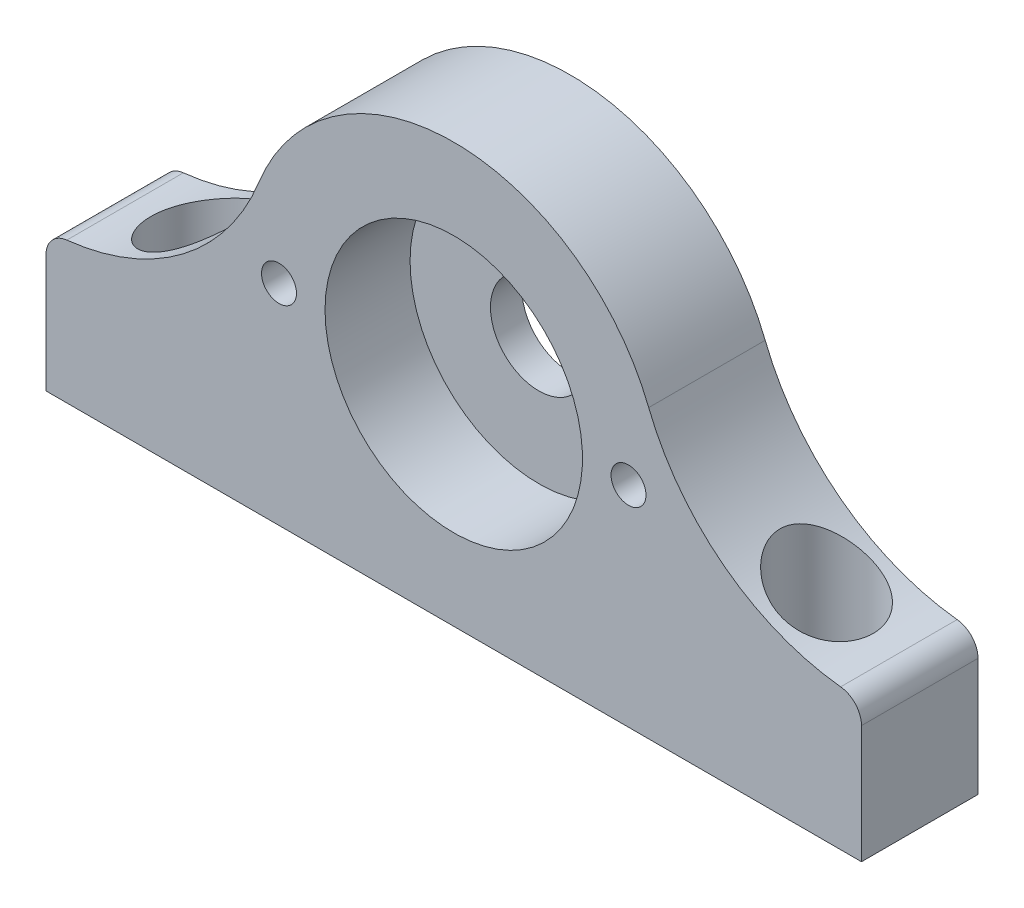
ISO-10303-21;
HEADER;
FILE_DESCRIPTION(('STEP AP214'),'2;1');
FILE_NAME('part.step','',(''),(''),'','','');
FILE_SCHEMA(('AUTOMOTIVE_DESIGN { 1 0 10303 214 1 1 1 1 }'));
ENDSEC;
DATA;
#1=APPLICATION_CONTEXT('core data for automotive mechanical design processes');
#2=APPLICATION_PROTOCOL_DEFINITION('international standard','automotive_design',2000,#1);
#3=PRODUCT_CONTEXT('',#1,'mechanical');
#4=PRODUCT('Part','Part','',(#3));
#5=PRODUCT_RELATED_PRODUCT_CATEGORY('part','',(#4));
#6=PRODUCT_DEFINITION_FORMATION('','',#4);
#7=PRODUCT_DEFINITION_CONTEXT('part definition',#1,'design');
#8=PRODUCT_DEFINITION('design','',#6,#7);
#9=PRODUCT_DEFINITION_SHAPE('','',#8);
#10=(LENGTH_UNIT() NAMED_UNIT(*) SI_UNIT(.MILLI.,.METRE.));
#11=(NAMED_UNIT(*) PLANE_ANGLE_UNIT() SI_UNIT($,.RADIAN.));
#12=(NAMED_UNIT(*) SI_UNIT($,.STERADIAN.) SOLID_ANGLE_UNIT());
#13=UNCERTAINTY_MEASURE_WITH_UNIT(LENGTH_MEASURE(1.E-05),#10,'distance_accuracy_value','');
#14=(GEOMETRIC_REPRESENTATION_CONTEXT(3) GLOBAL_UNCERTAINTY_ASSIGNED_CONTEXT((#13)) GLOBAL_UNIT_ASSIGNED_CONTEXT((#10,
#11,#12)) REPRESENTATION_CONTEXT('',''));
#15=CARTESIAN_POINT('',(0.,0.,0.));
#16=DIRECTION('',(0.,0.,1.));
#17=DIRECTION('',(1.,0.,0.));
#18=AXIS2_PLACEMENT_3D('',#15,#16,#17);
#19=CARTESIAN_POINT('',(-0.32811001388921,31.9973084143538,10.));
#20=DIRECTION('',(0.,0.,1.));
#21=DIRECTION('',(1.,0.,0.));
#22=AXIS2_PLACEMENT_3D('',#19,#20,#21);
#23=CYLINDRICAL_SURFACE('',#22,20.);
#24=CARTESIAN_POINT('',(-0.32811001388921,31.9973084143538,0.));
#25=DIRECTION('',(0.,0.,-1.));
#26=DIRECTION('',(-1.,0.,0.));
#27=AXIS2_PLACEMENT_3D('',#24,#25,#26);
#28=CIRCLE('',#27,20.);
#29=CARTESIAN_POINT('',(1.78835363510098,12.1096091602293,0.));
#30=VERTEX_POINT('',#29);
#31=CARTESIAN_POINT('',(18.2656320986841,24.6303039857465,0.));
#32=VERTEX_POINT('',#31);
#33=EDGE_CURVE('E148',#30,#32,#28,.F.);
#34=ORIENTED_EDGE('',*,*,#33,.F.);
#35=DIRECTION('',(0.,0.,1.));
#36=VECTOR('',#35,1.);
#37=CARTESIAN_POINT('',(1.78835363510098,12.1096091602293,10.));
#38=LINE('',#37,#36);
#39=CARTESIAN_POINT('',(1.78835363510098,12.1096091602293,10.));
#40=VERTEX_POINT('',#39);
#41=EDGE_CURVE('E11',#30,#40,#38,.T.);
#42=ORIENTED_EDGE('',*,*,#41,.T.);
#43=CARTESIAN_POINT('',(-0.32811001388921,31.9973084143538,10.));
#44=DIRECTION('',(0.,0.,-1.));
#45=DIRECTION('',(-1.,0.,0.));
#46=AXIS2_PLACEMENT_3D('',#43,#44,#45);
#47=CIRCLE('',#46,20.);
#48=CARTESIAN_POINT('',(18.2656320986841,24.6303039857465,10.));
#49=VERTEX_POINT('',#48);
#50=EDGE_CURVE('E151',#49,#40,#47,.T.);
#51=ORIENTED_EDGE('',*,*,#50,.F.);
#52=DIRECTION('',(0.,0.,-1.));
#53=VECTOR('',#52,1.);
#54=CARTESIAN_POINT('',(18.2656320986841,24.6303039857465,10.));
#55=LINE('',#54,#53);
#56=EDGE_CURVE('E140',#32,#49,#55,.F.);
#57=ORIENTED_EDGE('',*,*,#56,.F.);
#58=EDGE_LOOP('',(#34,#42,#51,#57));
#59=FACE_BOUND('',#58,.T.);
#60=CARTESIAN_POINT('',(8.,13.8137283599047,0.999999999999999));
#61=CARTESIAN_POINT('',(7.7754963424963,13.710912966327,1.00000989944578));
#62=CARTESIAN_POINT('',(7.54875378085976,13.6121375767227,1.01895585193193));
#63=CARTESIAN_POINT('',(7.0971776899619,13.4251503410963,1.09647067646765));
#64=CARTESIAN_POINT('',(6.87234916382854,13.3369610919557,1.15512259327818));
#65=CARTESIAN_POINT('',(6.43167759344868,13.1728386786401,1.31283064968684));
#66=CARTESIAN_POINT('',(6.21586012266342,13.0969388412203,1.41199416952861));
#67=CARTESIAN_POINT('',(5.80221914176793,12.9587515737909,1.64939593029033));
#68=CARTESIAN_POINT('',(5.60438171762477,12.8964535646029,1.78760361027511));
#69=CARTESIAN_POINT('',(5.24637760015165,12.7890317307045,2.08985208635841));
#70=CARTESIAN_POINT('',(5.08462314072547,12.7430733930484,2.25171777668953));
#71=CARTESIAN_POINT('',(4.79002372191389,12.6626740213477,2.60240533484942));
#72=CARTESIAN_POINT('',(4.65717496244465,12.6282314730614,2.7912236539431));
#73=CARTESIAN_POINT('',(4.43028613311162,12.5712735783199,3.1817555355937));
#74=CARTESIAN_POINT('',(4.33485401399075,12.5483192124996,3.38259813035788));
#75=CARTESIAN_POINT('',(4.17840984781063,12.5114730338817,3.79804343200512));
#76=CARTESIAN_POINT('',(4.11739430698871,12.4975803011795,4.01264473972294));
#77=CARTESIAN_POINT('',(4.03235803604842,12.478389056729,4.44669995713999));
#78=CARTESIAN_POINT('',(4.00789660110458,12.47298812373,4.66606316390823));
#79=CARTESIAN_POINT('',(3.99535474298327,12.4702067637641,5.10587777723814));
#80=CARTESIAN_POINT('',(4.00727366518411,12.4728261924803,5.32632916414802));
#81=CARTESIAN_POINT('',(4.06705067404718,12.4861966850023,5.76163475137688));
#82=CARTESIAN_POINT('',(4.11484252850121,12.4969327632978,5.97649851264305));
#83=CARTESIAN_POINT('',(4.24472546318307,12.5269826800965,6.39495646826751));
#84=CARTESIAN_POINT('',(4.3268157186887,12.5462963123488,6.59855093346836));
#85=CARTESIAN_POINT('',(4.52265995703091,12.5942119934642,6.98892755708889));
#86=CARTESIAN_POINT('',(4.63644195398522,12.6228222638955,7.17569464663696));
#87=CARTESIAN_POINT('',(4.89179061247152,12.6900556503927,7.52709455617719));
#88=CARTESIAN_POINT('',(5.03335662247364,12.7286785316717,7.69172789504914));
#89=CARTESIAN_POINT('',(5.34065199169879,12.8168283388195,7.99582198319928));
#90=CARTESIAN_POINT('',(5.50655767376598,12.8664363068767,8.13508083198902));
#91=CARTESIAN_POINT('',(5.85611768834561,12.9765599317395,8.38375496961795));
#92=CARTESIAN_POINT('',(6.039773459235,13.0370764728647,8.49316783713987));
#93=CARTESIAN_POINT('',(6.42445460352205,13.1705866246618,8.68306753452956));
#94=CARTESIAN_POINT('',(6.62582825318703,13.2438898614409,8.76262865619077));
#95=CARTESIAN_POINT('',(7.03500596406167,13.4007342260498,8.88775064613006));
#96=CARTESIAN_POINT('',(7.24281172546929,13.4842780783541,8.93330244340821));
#97=CARTESIAN_POINT('',(7.6728308530974,13.6658370720194,8.99287917428287));
#98=CARTESIAN_POINT('',(7.89510401839155,13.7644395051469,9.00466622568099));
#99=CARTESIAN_POINT('',(8.33500343482763,13.9692900719547,8.99202375241113));
#100=CARTESIAN_POINT('',(8.55262806979603,14.0755408104017,8.96758183326849));
#101=CARTESIAN_POINT('',(8.9985447190161,14.3031900413829,8.88062006738415));
#102=CARTESIAN_POINT('',(9.22593694656486,14.4250768160479,8.81475958147777));
#103=CARTESIAN_POINT('',(9.66488922240793,14.6709299371842,8.64467231280471));
#104=CARTESIAN_POINT('',(9.87643488081795,14.7948980515856,8.54041115560805));
#105=CARTESIAN_POINT('',(10.2937475516427,15.0491515264286,8.28673111078675));
#106=CARTESIAN_POINT('',(10.4979872558943,15.1792444243718,8.13458926374171));
#107=CARTESIAN_POINT('',(10.8770753987882,15.4294085346381,7.79067035993262));
#108=CARTESIAN_POINT('',(11.0519553521647,15.5494904221382,7.59893630099973));
#109=CARTESIAN_POINT('',(11.3272113543803,15.7438566404444,7.22914059370878));
#110=CARTESIAN_POINT('',(11.4353701268701,15.8221847838474,7.05904192069882));
#111=CARTESIAN_POINT('',(11.5788754104489,15.927857887832,6.78942337334215));
#112=CARTESIAN_POINT('',(11.6235951730241,15.9611176755853,6.69711957801438));
#113=CARTESIAN_POINT('',(11.7062588037052,16.023059389594,6.50807007161599));
#114=CARTESIAN_POINT('',(11.7442057568789,16.0517433995164,6.41132640831584));
#115=CARTESIAN_POINT('',(11.8131207286391,16.1041522628909,6.21294824024146));
#116=CARTESIAN_POINT('',(11.8440172531944,16.1278261506906,6.11127530796684));
#117=CARTESIAN_POINT('',(11.8978070221411,16.1692287183178,5.90470011284334));
#118=CARTESIAN_POINT('',(11.9207046552358,16.1869606580596,5.7997996553082));
#119=CARTESIAN_POINT('',(11.9580557000626,16.2159683778296,5.58769278423473));
#120=CARTESIAN_POINT('',(11.9725147162918,16.227248442763,5.48048795031879));
#121=CARTESIAN_POINT('',(11.9926966340524,16.2430108682642,5.26476915041013));
#122=CARTESIAN_POINT('',(11.9984210006125,16.2474943687924,5.15625540703372));
#123=CARTESIAN_POINT('',(12.0008208464177,16.2493733063579,4.95501897588378));
#124=CARTESIAN_POINT('',(11.9987011852913,16.2477125287522,4.86231631917834));
#125=CARTESIAN_POINT('',(11.9880509247603,16.2393825913348,4.67747640913591));
#126=CARTESIAN_POINT('',(11.9795183531012,16.2327118907502,4.58533933853205));
#127=CARTESIAN_POINT('',(11.9561788190529,16.2145182247594,4.40238086103717));
#128=CARTESIAN_POINT('',(11.9413739573991,16.2029968839533,4.31155902416679));
#129=CARTESIAN_POINT('',(11.905720535922,16.175364988171,4.13180742097664));
#130=CARTESIAN_POINT('',(11.884869591491,16.1592526225134,4.0428784160835));
#131=CARTESIAN_POINT('',(11.8148084714235,16.1053930889305,3.78402261321547));
#132=CARTESIAN_POINT('',(11.7574805810548,16.0616387172266,3.61744990403678));
#133=CARTESIAN_POINT('',(11.6234353917983,15.9608638107053,3.29676341141653));
#134=CARTESIAN_POINT('',(11.5467116830885,15.9038388908071,3.14265376896574));
#135=CARTESIAN_POINT('',(11.3642071174512,15.7706575134515,2.82748430143373));
#136=CARTESIAN_POINT('',(11.255838529907,15.6929307620953,2.66858974386977));
#137=CARTESIAN_POINT('',(11.0204512524018,15.5282212841517,2.37074632516326));
#138=CARTESIAN_POINT('',(10.8934224722104,15.4412335568741,2.23180833614824));
#139=CARTESIAN_POINT('',(10.5968127374274,15.2436924264213,1.94937253486413));
#140=CARTESIAN_POINT('',(10.4237794011991,15.1318732579651,1.81037207115646));
#141=CARTESIAN_POINT('',(10.0587394780578,14.9046264562947,1.56339032599698));
#142=CARTESIAN_POINT('',(9.8667074064925,14.7891941221973,1.45545148955041));
#143=CARTESIAN_POINT('',(9.44024750854738,14.5431589450133,1.25998321528114));
#144=CARTESIAN_POINT('',(9.20359134561079,14.4126038412973,1.17715139819259));
#145=CARTESIAN_POINT('',(8.8386575225774,14.2212179688644,1.08689903789869));
#146=CARTESIAN_POINT('',(8.71546284747412,14.1582151292349,1.06248711990996));
#147=CARTESIAN_POINT('',(8.46640277974749,14.0341294210639,1.02529487949682));
#148=CARTESIAN_POINT('',(8.34053929605636,13.9730452529098,1.01250651234189));
#149=CARTESIAN_POINT('',(8.14280869974656,13.8796441475577,1.00191533611605));
#150=CARTESIAN_POINT('',(8.07151795261353,13.8464812625861,0.999996846429576));
#151=CARTESIAN_POINT('',(8.,13.8137283599047,0.999999999999999));
#152=B_SPLINE_CURVE_WITH_KNOTS('',3,(#60,#61,#62,#63,#64,#65,#66,#67,#68,#69,#70,#71,#72,#73,
#74,#75,#76,#77,#78,#79,#80,#81,#82,#83,#84,#85,#86,#87,#88,#89,#90,#91,#92,#93,#94,#95,#96,#97,
#98,#99,#100,#101,#102,#103,#104,#105,#106,#107,#108,#109,#110,#111,#112,#113,#114,#115,#116,
#117,#118,#119,#120,#121,#122,#123,#124,#125,#126,#127,#128,#129,#130,#131,#132,#133,#134,#135,
#136,#137,#138,#139,#140,#141,#142,#143,#144,#145,#146,#147,#148,#149,#150,#151),.UNSPECIFIED.,
.T.,.F.,(4,2,2,2,2,2,2,2,2,2,2,2,2,2,2,2,2,2,2,2,2,2,2,2,2,2,2,2,2,2,2,2,2,2,2,2,2,2,2,2,2,2,2,
2,2,4),(0.,0.740539131539283,1.48263190047361,2.22670455949012,2.97019641845351,
3.66686422511732,4.36344038903253,5.03085025043582,5.6981923482317,6.35742200863536,
7.0166398070476,7.67464347600999,8.33263132385543,8.99120266031991,9.64975855525536,
10.3133451589067,10.9769855814008,11.6597743884257,12.3427452445473,13.0700395250216,
13.7975826812228,14.5930215194203,15.3891741335702,16.2429695662782,17.0958425934199,
17.7418576372615,18.0649897679988,18.3879743317668,18.7141013867472,19.0400492254999,
19.3657803393247,19.6914568135352,19.9693308568305,20.2472903937007,20.5251569089754,
20.8031331657186,21.3453244636568,21.8876951767242,22.5077381064657,23.1281175581595,
23.8707561266517,24.6144047266953,25.4580728013374,25.8791963514091,26.3000282168698,
26.5359345851971),.UNSPECIFIED.);
#153=CARTESIAN_POINT('',(8.,13.8137283599047,0.999999999999999));
#154=VERTEX_POINT('',#153);
#155=EDGE_CURVE('E196',#154,#154,#152,.T.);
#156=ORIENTED_EDGE('',*,*,#155,.F.);
#157=EDGE_LOOP('',(#156));
#158=FACE_BOUND('',#157,.T.);
#159=ADVANCED_FACE('F42',(#59,#158),#23,.F.);
#160=CARTESIAN_POINT('',(70.3281100138892,31.9973084143538,10.));
#161=DIRECTION('',(0.,0.,1.));
#162=DIRECTION('',(1.,0.,0.));
#163=AXIS2_PLACEMENT_3D('',#160,#161,#162);
#164=CYLINDRICAL_SURFACE('',#163,20.);
#165=CARTESIAN_POINT('',(70.3281100138892,31.9973084143538,10.));
#166=DIRECTION('',(0.,0.,-1.));
#167=DIRECTION('',(-1.,0.,0.));
#168=AXIS2_PLACEMENT_3D('',#165,#166,#167);
#169=CIRCLE('',#168,20.);
#170=CARTESIAN_POINT('',(68.211646364899,12.1096091602293,10.));
#171=VERTEX_POINT('',#170);
#172=CARTESIAN_POINT('',(51.7343679013159,24.6303039857465,10.));
#173=VERTEX_POINT('',#172);
#174=EDGE_CURVE('E158',#171,#173,#169,.T.);
#175=ORIENTED_EDGE('',*,*,#174,.F.);
#176=DIRECTION('',(0.,0.,1.));
#177=VECTOR('',#176,1.);
#178=CARTESIAN_POINT('',(68.211646364899,12.1096091602293,10.));
#179=LINE('',#178,#177);
#180=CARTESIAN_POINT('',(68.211646364899,12.1096091602293,0.));
#181=VERTEX_POINT('',#180);
#182=EDGE_CURVE('E161',#171,#181,#179,.F.);
#183=ORIENTED_EDGE('',*,*,#182,.T.);
#184=CARTESIAN_POINT('',(70.3281100138892,31.9973084143538,0.));
#185=DIRECTION('',(0.,0.,-1.));
#186=DIRECTION('',(-1.,0.,0.));
#187=AXIS2_PLACEMENT_3D('',#184,#185,#186);
#188=CIRCLE('',#187,20.);
#189=CARTESIAN_POINT('',(51.7343679013159,24.6303039857465,0.));
#190=VERTEX_POINT('',#189);
#191=EDGE_CURVE('E154',#190,#181,#188,.F.);
#192=ORIENTED_EDGE('',*,*,#191,.F.);
#193=DIRECTION('',(0.,0.,-1.));
#194=VECTOR('',#193,1.);
#195=CARTESIAN_POINT('',(51.7343679013159,24.6303039857465,10.));
#196=LINE('',#195,#194);
#197=EDGE_CURVE('E135',#173,#190,#196,.T.);
#198=ORIENTED_EDGE('',*,*,#197,.F.);
#199=EDGE_LOOP('',(#175,#183,#192,#198));
#200=FACE_BOUND('',#199,.T.);
#201=CARTESIAN_POINT('',(62.,13.8137283599047,1.));
#202=CARTESIAN_POINT('',(61.7469145360025,13.9296490570489,1.00000527793891));
#203=CARTESIAN_POINT('',(61.4961897091312,14.0509333662918,1.02405860935719));
#204=CARTESIAN_POINT('',(61.006659920051,14.3002388532642,1.1172811358129));
#205=CARTESIAN_POINT('',(60.7678671509039,14.4282666583265,1.18649550419371));
#206=CARTESIAN_POINT('',(60.3085802937315,14.6860906276666,1.36683808729097));
#207=CARTESIAN_POINT('',(60.088045774712,14.8158821011949,1.47787049802725));
#208=CARTESIAN_POINT('',(59.6694277031395,15.072395250427,1.73972810833614));
#209=CARTESIAN_POINT('',(59.4713593501407,15.1991148027729,1.89058002103001));
#210=CARTESIAN_POINT('',(59.1935422200792,15.3830302840832,2.14690165396801));
#211=CARTESIAN_POINT('',(59.103255097991,15.4439525450016,2.23854885914848));
#212=CARTESIAN_POINT('',(58.9308742051346,15.5621661178906,2.43149928122923));
#213=CARTESIAN_POINT('',(58.8487816571228,15.6194568875227,2.53280393477342));
#214=CARTESIAN_POINT('',(58.6939725598581,15.7290621924075,2.7444874152916));
#215=CARTESIAN_POINT('',(58.6212369903401,15.7813867639452,2.85484706277456));
#216=CARTESIAN_POINT('',(58.4860910333497,15.8798156860921,3.08423271864126));
#217=CARTESIAN_POINT('',(58.4236749748289,15.9259234505366,3.20325391496173));
#218=CARTESIAN_POINT('',(58.290413228206,16.0253641254902,3.49254863383799));
#219=CARTESIAN_POINT('',(58.2242935952579,16.0755559966792,3.66615263269501));
#220=CARTESIAN_POINT('',(58.1162345784484,16.1582810941863,4.02462857382739));
#221=CARTESIAN_POINT('',(58.0742695872151,16.1908330192167,4.20948835252874));
#222=CARTESIAN_POINT('',(58.0168173601803,16.2355365149441,4.58672812179803));
#223=CARTESIAN_POINT('',(58.0014602235142,16.2475878427643,4.77914038492926));
#224=CARTESIAN_POINT('',(57.9987397657483,16.2497167853831,5.16429293720824));
#225=CARTESIAN_POINT('',(58.0113753893069,16.2397952285709,5.35703321371598));
#226=CARTESIAN_POINT('',(58.0617511640774,16.2005583012428,5.72225887551451));
#227=CARTESIAN_POINT('',(58.0975522565835,16.1727417855418,5.89518391934403));
#228=CARTESIAN_POINT('',(58.1903824625033,16.101429410824,6.2317973020778));
#229=CARTESIAN_POINT('',(58.2474171155146,16.0579294602688,6.39548321775251));
#230=CARTESIAN_POINT('',(58.3852589600257,15.954358355467,6.72264215851954));
#231=CARTESIAN_POINT('',(58.4675305093964,15.8932875711964,6.88517483667593));
#232=CARTESIAN_POINT('',(58.650745793422,15.7599439253865,7.1942710816484));
#233=CARTESIAN_POINT('',(58.7516990240661,15.6876653699243,7.34082646665322));
#234=CARTESIAN_POINT('',(58.9899561962181,15.5209283218646,7.64256519117124));
#235=CARTESIAN_POINT('',(59.1305284120214,15.4248463651216,7.79426896706131));
#236=CARTESIAN_POINT('',(59.4306117248305,15.2259937622727,8.07248511462841));
#237=CARTESIAN_POINT('',(59.590136469261,15.1232183206478,8.19897915551493));
#238=CARTESIAN_POINT('',(59.9549302306398,14.8961072658424,8.44593358074882));
#239=CARTESIAN_POINT('',(60.1632878938684,14.7711895337349,8.56131467077785));
#240=CARTESIAN_POINT('',(60.5977385603591,14.5221121530685,8.75367338968268));
#241=CARTESIAN_POINT('',(60.8238408016875,14.3979529361442,8.8306308591576));
#242=CARTESIAN_POINT('',(61.1798857674906,14.211649749397,8.91709867813178));
#243=CARTESIAN_POINT('',(61.3054328457715,14.1476185391982,8.94132357339304));
#244=CARTESIAN_POINT('',(61.5592404740792,14.0215762294471,8.97770624993591));
#245=CARTESIAN_POINT('',(61.6874999003273,13.9595643192957,8.98986893252571));
#246=CARTESIAN_POINT('',(61.9458213617278,13.83807863564,9.00172332039622));
#247=CARTESIAN_POINT('',(62.0758837926765,13.7786054315073,9.00141224266661));
#248=CARTESIAN_POINT('',(62.3366425286663,13.6627295365009,8.98794455528125));
#249=CARTESIAN_POINT('',(62.4673384479434,13.6063251833908,8.97479497419365));
#250=CARTESIAN_POINT('',(62.7205094629122,13.5002240239431,8.93653094367775));
#251=CARTESIAN_POINT('',(62.8430146118142,13.450327815735,8.91216823812733));
#252=CARTESIAN_POINT('',(63.0863950349523,13.3539534940555,8.85168250889566));
#253=CARTESIAN_POINT('',(63.2072710963887,13.3074736775543,8.81556539405533));
#254=CARTESIAN_POINT('',(63.4462126542463,13.2181776355804,8.73155485260196));
#255=CARTESIAN_POINT('',(63.5642790205174,13.1753602653191,8.68366512407789));
#256=CARTESIAN_POINT('',(63.7963686546114,13.0935656377553,8.57622793330957));
#257=CARTESIAN_POINT('',(63.9103923307655,13.0545879919108,8.51668165241835));
#258=CARTESIAN_POINT('',(64.1220843415306,12.9842488265656,8.39268111014717));
#259=CARTESIAN_POINT('',(64.220255306484,12.9525153151569,8.3292936680479));
#260=CARTESIAN_POINT('',(64.4113099383427,12.8922957820259,8.19363538135342));
#261=CARTESIAN_POINT('',(64.5041940670694,12.8638094764316,8.12136531443027));
#262=CARTESIAN_POINT('',(64.6837271790152,12.8100802821568,7.96841901236613));
#263=CARTESIAN_POINT('',(64.7703779376412,12.7848364683182,7.88774518696261));
#264=CARTESIAN_POINT('',(64.9365925598259,12.7375314694845,7.71854482883138));
#265=CARTESIAN_POINT('',(65.0161566915117,12.7154701640576,7.63001859345772));
#266=CARTESIAN_POINT('',(65.1624738035172,12.6757770840403,7.45177091772315));
#267=CARTESIAN_POINT('',(65.2297230152322,12.6579508104144,7.36249947370897));
#268=CARTESIAN_POINT('',(65.35673118976,12.6249130706789,7.17827369902048));
#269=CARTESIAN_POINT('',(65.4164876620019,12.6097024733937,7.08331749415749));
#270=CARTESIAN_POINT('',(65.52791872393,12.5818129860145,6.88848561646223));
#271=CARTESIAN_POINT('',(65.5795972995835,12.5691328464281,6.78861240208148));
#272=CARTESIAN_POINT('',(65.6744664559561,12.5461905545938,6.58459957346098));
#273=CARTESIAN_POINT('',(65.7176539240057,12.5359292887832,6.48045841152015));
#274=CARTESIAN_POINT('',(65.7942015858511,12.5179556715241,6.27127452114048));
#275=CARTESIAN_POINT('',(65.8277734505257,12.5101878730238,6.16631394346464));
#276=CARTESIAN_POINT('',(65.886178802513,12.4967918504757,5.95381356194923));
#277=CARTESIAN_POINT('',(65.9110091132191,12.4911644041543,5.84627283563771));
#278=CARTESIAN_POINT('',(65.9517001841107,12.4819946211249,5.62946511788952));
#279=CARTESIAN_POINT('',(65.9675645381865,12.4784514489388,5.52019883619924));
#280=CARTESIAN_POINT('',(65.9902128641712,12.4734055401486,5.30064147477165));
#281=CARTESIAN_POINT('',(65.9969934855849,12.4719035564249,5.19035003200321));
#282=CARTESIAN_POINT('',(66.0013960061151,12.4709275204101,4.97016753081028));
#283=CARTESIAN_POINT('',(65.999066797559,12.4714426423592,4.86027749464327));
#284=CARTESIAN_POINT('',(65.9853758635872,12.4744830776188,4.64104887203792));
#285=CARTESIAN_POINT('',(65.9740108198914,12.4770091294146,4.53171050303882));
#286=CARTESIAN_POINT('',(65.9423421694145,12.4840999883965,4.31444576792261));
#287=CARTESIAN_POINT('',(65.9220420183535,12.4886640073934,4.20651887250823));
#288=CARTESIAN_POINT('',(65.8726622955003,12.4998822777086,3.99276330873496));
#289=CARTESIAN_POINT('',(65.8435794884023,12.5065372993354,3.88693542893553));
#290=CARTESIAN_POINT('',(65.7768900661994,12.5220018028764,3.67822499111562));
#291=CARTESIAN_POINT('',(65.7392886062063,12.5308099820485,3.57534069400513));
#292=CARTESIAN_POINT('',(65.6558722839699,12.5506627479441,3.37316861703318));
#293=CARTESIAN_POINT('',(65.6100544105436,12.5617081547683,3.27388217181621));
#294=CARTESIAN_POINT('',(65.46084471517,12.598332851553,2.98257095171012));
#295=CARTESIAN_POINT('',(65.3456215690726,12.627417308215,2.79686027200004));
#296=CARTESIAN_POINT('',(65.0872754300327,12.6957156346002,2.4473183333512));
#297=CARTESIAN_POINT('',(64.944064432429,12.7349615858575,2.28355890959077));
#298=CARTESIAN_POINT('',(64.6347975360399,12.8240969865307,1.98265533105207));
#299=CARTESIAN_POINT('',(64.4687400692646,12.8739871666068,1.84551300460659));
#300=CARTESIAN_POINT('',(64.1164218290736,12.9854810040745,1.59885556112503));
#301=CARTESIAN_POINT('',(63.9298709535694,13.0472656902398,1.48983791187073));
#302=CARTESIAN_POINT('',(63.5449824462002,13.1816050997243,1.30423439928548));
#303=CARTESIAN_POINT('',(63.3466459837857,13.2541587555356,1.22764532426621));
#304=CARTESIAN_POINT('',(62.9568717483182,13.4041470240843,1.1111549036036));
#305=CARTESIAN_POINT('',(62.7657992381024,13.480976380006,1.06922743945894));
#306=CARTESIAN_POINT('',(62.3827046777823,13.6420966642863,1.01364310729985));
#307=CARTESIAN_POINT('',(62.1906823220835,13.7263901644989,0.999996023439553));
#308=CARTESIAN_POINT('',(62.,13.8137283599047,1.));
#309=B_SPLINE_CURVE_WITH_KNOTS('',3,(#201,#202,#203,#204,#205,#206,#207,#208,#209,#210,#211,
#212,#213,#214,#215,#216,#217,#218,#219,#220,#221,#222,#223,#224,#225,#226,#227,#228,#229,#230,
#231,#232,#233,#234,#235,#236,#237,#238,#239,#240,#241,#242,#243,#244,#245,#246,#247,#248,#249,
#250,#251,#252,#253,#254,#255,#256,#257,#258,#259,#260,#261,#262,#263,#264,#265,#266,#267,#268,
#269,#270,#271,#272,#273,#274,#275,#276,#277,#278,#279,#280,#281,#282,#283,#284,#285,#286,#287,
#288,#289,#290,#291,#292,#293,#294,#295,#296,#297,#298,#299,#300,#301,#302,#303,#304,#305,#306,
#307,#308),.UNSPECIFIED.,.T.,.F.,(4,2,2,2,2,2,2,2,2,2,2,2,2,2,2,2,2,2,2,2,2,2,2,2,2,2,2,2,2,2,2,
2,2,2,2,2,2,2,2,2,2,2,2,2,2,2,2,2,2,2,2,2,2,4),(0.,0.834306994658206,1.66944980567586,
2.50269085225648,3.33649230989348,3.76303420204818,4.18963964596872,4.61536373003542,
5.04085307575697,5.61563066221187,6.18979777461694,6.76676443758886,7.34370934898589,
7.87770092860065,8.41183191836197,8.98610130902411,9.5606634094279,10.2422708361924,
10.9243720872376,11.7278535127446,12.5317560523337,12.9602939231465,13.3886575922707,
13.817116833789,14.2453416424252,14.6482998265048,15.0510557590267,15.4536853365755,
15.856274130054,16.2190713780617,16.5818368858365,16.9444986571927,17.307146701178,
17.6462716354807,17.9855089970548,18.3245784328705,18.6637719339235,18.9947944937088,
19.3259372204225,19.6569471184535,19.988079074463,20.3174362951028,20.6469145233258,
20.9762654351755,21.3057378197796,21.6350113523497,21.9644058058955,22.6224648419458,
23.2826273662757,23.9428352212414,24.6140243763365,25.2851470420799,25.913522063258,
26.5421144468708),.UNSPECIFIED.);
#310=CARTESIAN_POINT('',(62.,13.8137283599047,1.));
#311=VERTEX_POINT('',#310);
#312=EDGE_CURVE('E187',#311,#311,#309,.T.);
#313=ORIENTED_EDGE('',*,*,#312,.F.);
#314=EDGE_LOOP('',(#313));
#315=FACE_BOUND('',#314,.T.);
#316=ADVANCED_FACE('F203',(#200,#315),#164,.F.);
#317=CARTESIAN_POINT('',(0.,0.,10.));
#318=DIRECTION('',(1.,0.,0.));
#319=DIRECTION('',(0.,0.,-1.));
#320=AXIS2_PLACEMENT_3D('',#317,#318,#319);
#321=PLANE('',#320);
#322=DIRECTION('',(0.,-1.,0.));
#323=VECTOR('',#322,1.);
#324=CARTESIAN_POINT('',(0.,0.,10.));
#325=LINE('',#324,#323);
#326=CARTESIAN_POINT('',(0.,10.1208392348169,10.));
#327=VERTEX_POINT('',#326);
#328=CARTESIAN_POINT('',(0.,0.,10.));
#329=VERTEX_POINT('',#328);
#330=EDGE_CURVE('E107',#327,#329,#325,.T.);
#331=ORIENTED_EDGE('',*,*,#330,.F.);
#332=DIRECTION('',(0.,0.,1.));
#333=VECTOR('',#332,1.);
#334=CARTESIAN_POINT('',(0.,10.1208392348169,10.));
#335=LINE('',#334,#333);
#336=CARTESIAN_POINT('',(0.,10.1208392348169,0.));
#337=VERTEX_POINT('',#336);
#338=EDGE_CURVE('E52',#327,#337,#335,.F.);
#339=ORIENTED_EDGE('',*,*,#338,.T.);
#340=DIRECTION('',(0.,-1.,0.));
#341=VECTOR('',#340,1.);
#342=CARTESIAN_POINT('',(0.,0.,0.));
#343=LINE('',#342,#341);
#344=CARTESIAN_POINT('',(0.,0.,0.));
#345=VERTEX_POINT('',#344);
#346=EDGE_CURVE('E132',#337,#345,#343,.T.);
#347=ORIENTED_EDGE('',*,*,#346,.T.);
#348=DIRECTION('',(0.,0.,-1.));
#349=VECTOR('',#348,1.);
#350=CARTESIAN_POINT('',(0.,0.,10.));
#351=LINE('',#350,#349);
#352=EDGE_CURVE('E123',#329,#345,#351,.T.);
#353=ORIENTED_EDGE('',*,*,#352,.F.);
#354=EDGE_LOOP('',(#331,#339,#347,#353));
#355=FACE_BOUND('',#354,.T.);
#356=ADVANCED_FACE('F130',(#355),#321,.F.);
#357=CARTESIAN_POINT('',(0.,0.,10.));
#358=DIRECTION('',(0.,1.,0.));
#359=DIRECTION('',(0.,0.,1.));
#360=AXIS2_PLACEMENT_3D('',#357,#358,#359);
#361=PLANE('',#360);
#362=CARTESIAN_POINT('',(8.,0.,5.));
#363=DIRECTION('',(0.,1.,0.));
#364=DIRECTION('',(0.,0.,1.));
#365=AXIS2_PLACEMENT_3D('',#362,#363,#364);
#366=CIRCLE('',#365,2.);
#367=CARTESIAN_POINT('',(8.,0.,3.));
#368=VERTEX_POINT('',#367);
#369=EDGE_CURVE('E528',#368,#368,#366,.T.);
#370=ORIENTED_EDGE('',*,*,#369,.T.);
#371=EDGE_LOOP('',(#370));
#372=FACE_BOUND('',#371,.T.);
#373=CARTESIAN_POINT('',(62.,0.,5.));
#374=DIRECTION('',(0.,1.,0.));
#375=DIRECTION('',(0.,0.,1.));
#376=AXIS2_PLACEMENT_3D('',#373,#374,#375);
#377=CIRCLE('',#376,1.99999999999999);
#378=CARTESIAN_POINT('',(62.,0.,3.00000000000001));
#379=VERTEX_POINT('',#378);
#380=EDGE_CURVE('E522',#379,#379,#377,.T.);
#381=ORIENTED_EDGE('',*,*,#380,.T.);
#382=EDGE_LOOP('',(#381));
#383=FACE_BOUND('',#382,.T.);
#384=DIRECTION('',(1.,0.,0.));
#385=VECTOR('',#384,1.);
#386=CARTESIAN_POINT('',(0.,0.,0.));
#387=LINE('',#386,#385);
#388=CARTESIAN_POINT('',(70.,0.,0.));
#389=VERTEX_POINT('',#388);
#390=EDGE_CURVE('E284',#345,#389,#387,.T.);
#391=ORIENTED_EDGE('',*,*,#390,.T.);
#392=DIRECTION('',(0.,0.,-1.));
#393=VECTOR('',#392,1.);
#394=CARTESIAN_POINT('',(70.,0.,10.));
#395=LINE('',#394,#393);
#396=CARTESIAN_POINT('',(70.,0.,10.));
#397=VERTEX_POINT('',#396);
#398=EDGE_CURVE('E125',#397,#389,#395,.T.);
#399=ORIENTED_EDGE('',*,*,#398,.F.);
#400=DIRECTION('',(1.,0.,0.));
#401=VECTOR('',#400,1.);
#402=CARTESIAN_POINT('',(0.,0.,10.));
#403=LINE('',#402,#401);
#404=EDGE_CURVE('E111',#329,#397,#403,.T.);
#405=ORIENTED_EDGE('',*,*,#404,.F.);
#406=ORIENTED_EDGE('',*,*,#352,.T.);
#407=EDGE_LOOP('',(#391,#399,#405,#406));
#408=FACE_BOUND('',#407,.T.);
#409=ADVANCED_FACE('F122',(#372,#383,#408),#361,.F.);
#410=CARTESIAN_POINT('',(70.,0.,10.));
#411=DIRECTION('',(-1.,0.,0.));
#412=DIRECTION('',(0.,0.,1.));
#413=AXIS2_PLACEMENT_3D('',#410,#411,#412);
#414=PLANE('',#413);
#415=DIRECTION('',(0.,1.,0.));
#416=VECTOR('',#415,1.);
#417=CARTESIAN_POINT('',(70.,0.,0.));
#418=LINE('',#417,#416);
#419=CARTESIAN_POINT('',(70.,10.1208392348169,0.));
#420=VERTEX_POINT('',#419);
#421=EDGE_CURVE('E287',#389,#420,#418,.T.);
#422=ORIENTED_EDGE('',*,*,#421,.T.);
#423=DIRECTION('',(0.,0.,1.));
#424=VECTOR('',#423,1.);
#425=CARTESIAN_POINT('',(70.,10.1208392348169,10.));
#426=LINE('',#425,#424);
#427=CARTESIAN_POINT('',(70.,10.1208392348169,10.));
#428=VERTEX_POINT('',#427);
#429=EDGE_CURVE('E177',#420,#428,#426,.T.);
#430=ORIENTED_EDGE('',*,*,#429,.T.);
#431=DIRECTION('',(0.,1.,0.));
#432=VECTOR('',#431,1.);
#433=CARTESIAN_POINT('',(70.,0.,10.));
#434=LINE('',#433,#432);
#435=EDGE_CURVE('E128',#397,#428,#434,.T.);
#436=ORIENTED_EDGE('',*,*,#435,.F.);
#437=ORIENTED_EDGE('',*,*,#398,.T.);
#438=EDGE_LOOP('',(#422,#430,#436,#437));
#439=FACE_BOUND('',#438,.T.);
#440=ADVANCED_FACE('F240',(#439),#414,.F.);
#441=CARTESIAN_POINT('',(35.,18.,10.));
#442=DIRECTION('',(0.,0.,-1.));
#443=DIRECTION('',(-1.,0.,0.));
#444=AXIS2_PLACEMENT_3D('',#441,#442,#443);
#445=CYLINDRICAL_SURFACE('',#444,18.);
#446=CARTESIAN_POINT('',(35.,18.,0.));
#447=DIRECTION('',(0.,0.,1.));
#448=DIRECTION('',(-1.,0.,0.));
#449=AXIS2_PLACEMENT_3D('',#446,#447,#448);
#450=CIRCLE('',#449,18.);
#451=EDGE_CURVE('E118',#190,#32,#450,.T.);
#452=ORIENTED_EDGE('',*,*,#451,.T.);
#453=ORIENTED_EDGE('',*,*,#56,.T.);
#454=CARTESIAN_POINT('',(35.,18.,10.));
#455=DIRECTION('',(0.,0.,1.));
#456=DIRECTION('',(-1.,0.,0.));
#457=AXIS2_PLACEMENT_3D('',#454,#455,#456);
#458=CIRCLE('',#457,18.);
#459=EDGE_CURVE('E142',#173,#49,#458,.T.);
#460=ORIENTED_EDGE('',*,*,#459,.F.);
#461=ORIENTED_EDGE('',*,*,#197,.T.);
#462=EDGE_LOOP('',(#452,#453,#460,#461));
#463=FACE_BOUND('',#462,.T.);
#464=ADVANCED_FACE('F233',(#463),#445,.T.);
#465=CARTESIAN_POINT('',(35.,18.,10.));
#466=DIRECTION('',(0.,0.,-1.));
#467=DIRECTION('',(-1.,0.,0.));
#468=AXIS2_PLACEMENT_3D('',#465,#466,#467);
#469=PLANE('',#468);
#470=CARTESIAN_POINT('',(20.,18.,10.));
#471=DIRECTION('',(0.,0.,-1.));
#472=DIRECTION('',(-1.,0.,0.));
#473=AXIS2_PLACEMENT_3D('',#470,#471,#472);
#474=CIRCLE('',#473,1.5);
#475=CARTESIAN_POINT('',(18.5,18.,10.));
#476=VERTEX_POINT('',#475);
#477=EDGE_CURVE('E523',#476,#476,#474,.T.);
#478=ORIENTED_EDGE('',*,*,#477,.T.);
#479=EDGE_LOOP('',(#478));
#480=FACE_BOUND('',#479,.T.);
#481=CARTESIAN_POINT('',(50.,18.,10.));
#482=DIRECTION('',(0.,0.,-1.));
#483=DIRECTION('',(-1.,0.,0.));
#484=AXIS2_PLACEMENT_3D('',#481,#482,#483);
#485=CIRCLE('',#484,1.5);
#486=CARTESIAN_POINT('',(48.5,18.,10.));
#487=VERTEX_POINT('',#486);
#488=EDGE_CURVE('E531',#487,#487,#485,.T.);
#489=ORIENTED_EDGE('',*,*,#488,.T.);
#490=EDGE_LOOP('',(#489));
#491=FACE_BOUND('',#490,.T.);
#492=CARTESIAN_POINT('',(35.,18.,10.));
#493=DIRECTION('',(0.,0.,-1.));
#494=DIRECTION('',(-1.,0.,0.));
#495=AXIS2_PLACEMENT_3D('',#492,#493,#494);
#496=CIRCLE('',#495,11.05);
#497=CARTESIAN_POINT('',(23.95,18.,10.));
#498=VERTEX_POINT('',#497);
#499=EDGE_CURVE('E166',#498,#498,#496,.T.);
#500=ORIENTED_EDGE('',*,*,#499,.T.);
#501=EDGE_LOOP('',(#500));
#502=FACE_BOUND('',#501,.T.);
#503=ORIENTED_EDGE('',*,*,#435,.T.);
#504=CARTESIAN_POINT('',(68.,10.1208392348169,10.));
#505=DIRECTION('',(0.,0.,-1.));
#506=DIRECTION('',(-1.,0.,0.));
#507=AXIS2_PLACEMENT_3D('',#504,#505,#506);
#508=CIRCLE('',#507,2.);
#509=EDGE_CURVE('E182',#428,#171,#508,.F.);
#510=ORIENTED_EDGE('',*,*,#509,.T.);
#511=ORIENTED_EDGE('',*,*,#174,.T.);
#512=ORIENTED_EDGE('',*,*,#459,.T.);
#513=ORIENTED_EDGE('',*,*,#50,.T.);
#514=CARTESIAN_POINT('',(2.,10.1208392348169,10.));
#515=DIRECTION('',(0.,0.,-1.));
#516=DIRECTION('',(-1.,0.,0.));
#517=AXIS2_PLACEMENT_3D('',#514,#515,#516);
#518=CIRCLE('',#517,2.);
#519=EDGE_CURVE('E65',#40,#327,#518,.F.);
#520=ORIENTED_EDGE('',*,*,#519,.T.);
#521=ORIENTED_EDGE('',*,*,#330,.T.);
#522=ORIENTED_EDGE('',*,*,#404,.T.);
#523=EDGE_LOOP('',(#503,#510,#511,#512,#513,#520,#521,#522));
#524=FACE_BOUND('',#523,.T.);
#525=ADVANCED_FACE('F110',(#480,#491,#502,#524),#469,.F.);
#526=CARTESIAN_POINT('',(35.,18.,0.));
#527=DIRECTION('',(0.,0.,-1.));
#528=DIRECTION('',(-1.,0.,0.));
#529=AXIS2_PLACEMENT_3D('',#526,#527,#528);
#530=PLANE('',#529);
#531=CARTESIAN_POINT('',(35.,18.,0.));
#532=DIRECTION('',(0.,0.,1.));
#533=DIRECTION('',(1.,0.,0.));
#534=AXIS2_PLACEMENT_3D('',#531,#532,#533);
#535=CIRCLE('',#534,4.15);
#536=CARTESIAN_POINT('',(39.15,18.,0.));
#537=VERTEX_POINT('',#536);
#538=EDGE_CURVE('E167',#537,#537,#535,.T.);
#539=ORIENTED_EDGE('',*,*,#538,.T.);
#540=EDGE_LOOP('',(#539));
#541=FACE_BOUND('',#540,.T.);
#542=ORIENTED_EDGE('',*,*,#191,.T.);
#543=CARTESIAN_POINT('',(68.,10.1208392348169,0.));
#544=DIRECTION('',(0.,0.,-1.));
#545=DIRECTION('',(-1.,0.,0.));
#546=AXIS2_PLACEMENT_3D('',#543,#544,#545);
#547=CIRCLE('',#546,2.);
#548=EDGE_CURVE('E174',#181,#420,#547,.T.);
#549=ORIENTED_EDGE('',*,*,#548,.T.);
#550=ORIENTED_EDGE('',*,*,#421,.F.);
#551=ORIENTED_EDGE('',*,*,#390,.F.);
#552=ORIENTED_EDGE('',*,*,#346,.F.);
#553=CARTESIAN_POINT('',(2.,10.1208392348169,0.));
#554=DIRECTION('',(0.,0.,-1.));
#555=DIRECTION('',(-1.,0.,0.));
#556=AXIS2_PLACEMENT_3D('',#553,#554,#555);
#557=CIRCLE('',#556,2.);
#558=EDGE_CURVE('E171',#337,#30,#557,.T.);
#559=ORIENTED_EDGE('',*,*,#558,.T.);
#560=ORIENTED_EDGE('',*,*,#33,.T.);
#561=ORIENTED_EDGE('',*,*,#451,.F.);
#562=EDGE_LOOP('',(#542,#549,#550,#551,#552,#559,#560,#561));
#563=FACE_BOUND('',#562,.T.);
#564=ADVANCED_FACE('F229',(#541,#563),#530,.T.);
#565=CARTESIAN_POINT('',(35.,18.,2.7));
#566=DIRECTION('',(0.,0.,1.));
#567=DIRECTION('',(1.,0.,0.));
#568=AXIS2_PLACEMENT_3D('',#565,#566,#567);
#569=CYLINDRICAL_SURFACE('',#568,11.05);
#570=CARTESIAN_POINT('',(35.,18.,2.7));
#571=DIRECTION('',(0.,0.,-1.));
#572=DIRECTION('',(-1.,0.,0.));
#573=AXIS2_PLACEMENT_3D('',#570,#571,#572);
#574=CIRCLE('',#573,11.05);
#575=CARTESIAN_POINT('',(23.95,18.,2.7));
#576=VERTEX_POINT('',#575);
#577=EDGE_CURVE('E270',#576,#576,#574,.T.);
#578=ORIENTED_EDGE('',*,*,#577,.T.);
#579=EDGE_LOOP('',(#578));
#580=FACE_BOUND('',#579,.T.);
#581=ORIENTED_EDGE('',*,*,#499,.F.);
#582=EDGE_LOOP('',(#581));
#583=FACE_BOUND('',#582,.T.);
#584=ADVANCED_FACE('F225',(#580,#583),#569,.F.);
#585=CARTESIAN_POINT('',(35.,18.,2.7));
#586=DIRECTION('',(0.,0.,-1.));
#587=DIRECTION('',(-1.,0.,0.));
#588=AXIS2_PLACEMENT_3D('',#585,#586,#587);
#589=PLANE('',#588);
#590=CARTESIAN_POINT('',(35.,18.,2.7));
#591=DIRECTION('',(0.,0.,-1.));
#592=DIRECTION('',(-1.,0.,0.));
#593=AXIS2_PLACEMENT_3D('',#590,#591,#592);
#594=CIRCLE('',#593,4.15);
#595=CARTESIAN_POINT('',(30.85,18.,2.7));
#596=VERTEX_POINT('',#595);
#597=EDGE_CURVE('E162',#596,#596,#594,.F.);
#598=ORIENTED_EDGE('',*,*,#597,.F.);
#599=EDGE_LOOP('',(#598));
#600=FACE_BOUND('',#599,.T.);
#601=ORIENTED_EDGE('',*,*,#577,.F.);
#602=EDGE_LOOP('',(#601));
#603=FACE_BOUND('',#602,.T.);
#604=ADVANCED_FACE('F221',(#600,#603),#589,.F.);
#605=CARTESIAN_POINT('',(35.,18.,10.));
#606=DIRECTION('',(0.,0.,-1.));
#607=DIRECTION('',(-1.,0.,0.));
#608=AXIS2_PLACEMENT_3D('',#605,#606,#607);
#609=CYLINDRICAL_SURFACE('',#608,4.15);
#610=ORIENTED_EDGE('',*,*,#538,.F.);
#611=EDGE_LOOP('',(#610));
#612=FACE_BOUND('',#611,.T.);
#613=ORIENTED_EDGE('',*,*,#597,.T.);
#614=EDGE_LOOP('',(#613));
#615=FACE_BOUND('',#614,.T.);
#616=ADVANCED_FACE('F217',(#612,#615),#609,.F.);
#617=CARTESIAN_POINT('',(68.,10.1208392348169,10.));
#618=DIRECTION('',(0.,0.,1.));
#619=DIRECTION('',(1.,0.,0.));
#620=AXIS2_PLACEMENT_3D('',#617,#618,#619);
#621=CYLINDRICAL_SURFACE('',#620,2.);
#622=ORIENTED_EDGE('',*,*,#509,.F.);
#623=ORIENTED_EDGE('',*,*,#429,.F.);
#624=ORIENTED_EDGE('',*,*,#548,.F.);
#625=ORIENTED_EDGE('',*,*,#182,.F.);
#626=EDGE_LOOP('',(#622,#623,#624,#625));
#627=FACE_BOUND('',#626,.T.);
#628=ADVANCED_FACE('F220',(#627),#621,.T.);
#629=CARTESIAN_POINT('',(2.,10.1208392348169,10.));
#630=DIRECTION('',(0.,0.,1.));
#631=DIRECTION('',(1.,0.,0.));
#632=AXIS2_PLACEMENT_3D('',#629,#630,#631);
#633=CYLINDRICAL_SURFACE('',#632,2.);
#634=ORIENTED_EDGE('',*,*,#519,.F.);
#635=ORIENTED_EDGE('',*,*,#41,.F.);
#636=ORIENTED_EDGE('',*,*,#558,.F.);
#637=ORIENTED_EDGE('',*,*,#338,.F.);
#638=EDGE_LOOP('',(#634,#635,#636,#637));
#639=FACE_BOUND('',#638,.T.);
#640=ADVANCED_FACE('F44',(#639),#633,.T.);
#641=CARTESIAN_POINT('',(62.,17.,5.));
#642=DIRECTION('',(0.,-1.,0.));
#643=DIRECTION('',(0.,0.,-1.));
#644=AXIS2_PLACEMENT_3D('',#641,#642,#643);
#645=CYLINDRICAL_SURFACE('',#644,4.);
#646=CARTESIAN_POINT('',(62.,4.,5.));
#647=DIRECTION('',(0.,1.,0.));
#648=DIRECTION('',(0.,0.,1.));
#649=AXIS2_PLACEMENT_3D('',#646,#647,#648);
#650=CIRCLE('',#649,4.);
#651=CARTESIAN_POINT('',(62.,4.,9.));
#652=VERTEX_POINT('',#651);
#653=EDGE_CURVE('E268',#652,#652,#650,.T.);
#654=ORIENTED_EDGE('',*,*,#653,.F.);
#655=EDGE_LOOP('',(#654));
#656=FACE_BOUND('',#655,.T.);
#657=ORIENTED_EDGE('',*,*,#312,.T.);
#658=EDGE_LOOP('',(#657));
#659=FACE_BOUND('',#658,.T.);
#660=ADVANCED_FACE('F205',(#656,#659),#645,.F.);
#661=CARTESIAN_POINT('',(62.,4.,5.));
#662=DIRECTION('',(0.,1.,0.));
#663=DIRECTION('',(0.,0.,1.));
#664=AXIS2_PLACEMENT_3D('',#661,#662,#663);
#665=PLANE('',#664);
#666=CARTESIAN_POINT('',(62.,4.,5.));
#667=DIRECTION('',(0.,1.,0.));
#668=DIRECTION('',(0.,0.,1.));
#669=AXIS2_PLACEMENT_3D('',#666,#667,#668);
#670=CIRCLE('',#669,1.99999999999999);
#671=CARTESIAN_POINT('',(62.,4.,3.00000000000001));
#672=VERTEX_POINT('',#671);
#673=EDGE_CURVE('E46',#672,#672,#670,.F.);
#674=ORIENTED_EDGE('',*,*,#673,.T.);
#675=EDGE_LOOP('',(#674));
#676=FACE_BOUND('',#675,.T.);
#677=ORIENTED_EDGE('',*,*,#653,.T.);
#678=EDGE_LOOP('',(#677));
#679=FACE_BOUND('',#678,.T.);
#680=ADVANCED_FACE('F209',(#676,#679),#665,.T.);
#681=CARTESIAN_POINT('',(8.,17.,5.));
#682=DIRECTION('',(0.,-1.,0.));
#683=DIRECTION('',(0.,0.,-1.));
#684=AXIS2_PLACEMENT_3D('',#681,#682,#683);
#685=CYLINDRICAL_SURFACE('',#684,4.);
#686=CARTESIAN_POINT('',(8.,4.,5.));
#687=DIRECTION('',(0.,1.,0.));
#688=DIRECTION('',(0.,0.,1.));
#689=AXIS2_PLACEMENT_3D('',#686,#687,#688);
#690=CIRCLE('',#689,4.);
#691=CARTESIAN_POINT('',(8.,4.,9.));
#692=VERTEX_POINT('',#691);
#693=EDGE_CURVE('E197',#692,#692,#690,.T.);
#694=ORIENTED_EDGE('',*,*,#693,.F.);
#695=EDGE_LOOP('',(#694));
#696=FACE_BOUND('',#695,.T.);
#697=ORIENTED_EDGE('',*,*,#155,.T.);
#698=EDGE_LOOP('',(#697));
#699=FACE_BOUND('',#698,.T.);
#700=ADVANCED_FACE('F211',(#696,#699),#685,.F.);
#701=CARTESIAN_POINT('',(8.,4.,5.));
#702=DIRECTION('',(0.,1.,0.));
#703=DIRECTION('',(0.,0.,1.));
#704=AXIS2_PLACEMENT_3D('',#701,#702,#703);
#705=PLANE('',#704);
#706=CARTESIAN_POINT('',(8.,4.,5.));
#707=DIRECTION('',(0.,1.,0.));
#708=DIRECTION('',(0.,0.,1.));
#709=AXIS2_PLACEMENT_3D('',#706,#707,#708);
#710=CIRCLE('',#709,2.);
#711=CARTESIAN_POINT('',(8.,4.,3.));
#712=VERTEX_POINT('',#711);
#713=EDGE_CURVE('E543',#712,#712,#710,.F.);
#714=ORIENTED_EDGE('',*,*,#713,.T.);
#715=EDGE_LOOP('',(#714));
#716=FACE_BOUND('',#715,.T.);
#717=ORIENTED_EDGE('',*,*,#693,.T.);
#718=EDGE_LOOP('',(#717));
#719=FACE_BOUND('',#718,.T.);
#720=ADVANCED_FACE('F337',(#716,#719),#705,.T.);
#721=CARTESIAN_POINT('',(8.,13.,5.));
#722=DIRECTION('',(0.,-1.,0.));
#723=DIRECTION('',(0.,0.,-1.));
#724=AXIS2_PLACEMENT_3D('',#721,#722,#723);
#725=CYLINDRICAL_SURFACE('',#724,2.);
#726=CARTESIAN_POINT('',(8.,4.,3.));
#727=CARTESIAN_POINT('',(8.,3.95833333333333,3.));
#728=CARTESIAN_POINT('',(8.,3.91666666666667,3.));
#729=CARTESIAN_POINT('',(8.,3.83333333333333,3.));
#730=CARTESIAN_POINT('',(8.,3.79166666666667,3.));
#731=CARTESIAN_POINT('',(8.,3.70833333333333,3.));
#732=CARTESIAN_POINT('',(8.,3.66666666666667,3.));
#733=CARTESIAN_POINT('',(8.,3.58333333333333,3.));
#734=CARTESIAN_POINT('',(8.,3.54166666666667,3.));
#735=CARTESIAN_POINT('',(8.,3.45833333333333,3.));
#736=CARTESIAN_POINT('',(8.,3.41666666666667,3.));
#737=CARTESIAN_POINT('',(8.,3.33333333333333,3.));
#738=CARTESIAN_POINT('',(8.,3.29166666666667,3.));
#739=CARTESIAN_POINT('',(8.,3.20833333333333,3.));
#740=CARTESIAN_POINT('',(8.,3.16666666666667,3.));
#741=CARTESIAN_POINT('',(8.,3.08333333333333,3.));
#742=CARTESIAN_POINT('',(8.,3.04166666666667,3.));
#743=CARTESIAN_POINT('',(8.,2.95833333333333,3.));
#744=CARTESIAN_POINT('',(8.,2.91666666666667,3.));
#745=CARTESIAN_POINT('',(8.,2.83333333333333,3.));
#746=CARTESIAN_POINT('',(8.,2.79166666666667,3.));
#747=CARTESIAN_POINT('',(8.,2.70833333333333,3.));
#748=CARTESIAN_POINT('',(8.,2.66666666666667,3.));
#749=CARTESIAN_POINT('',(8.,2.58333333333333,3.));
#750=CARTESIAN_POINT('',(8.,2.54166666666667,3.));
#751=CARTESIAN_POINT('',(8.,2.45833333333333,3.));
#752=CARTESIAN_POINT('',(8.,2.41666666666667,3.));
#753=CARTESIAN_POINT('',(8.,2.33333333333333,3.));
#754=CARTESIAN_POINT('',(8.,2.29166666666667,3.));
#755=CARTESIAN_POINT('',(8.,2.20833333333333,3.));
#756=CARTESIAN_POINT('',(8.,2.16666666666667,3.));
#757=CARTESIAN_POINT('',(8.,2.08333333333333,3.));
#758=CARTESIAN_POINT('',(8.,2.04166666666667,3.));
#759=CARTESIAN_POINT('',(8.,1.95833333333333,3.));
#760=CARTESIAN_POINT('',(8.,1.91666666666667,3.));
#761=CARTESIAN_POINT('',(8.,1.83333333333333,3.));
#762=CARTESIAN_POINT('',(8.,1.79166666666667,3.));
#763=CARTESIAN_POINT('',(8.,1.70833333333333,3.));
#764=CARTESIAN_POINT('',(8.,1.66666666666667,3.));
#765=CARTESIAN_POINT('',(8.,1.58333333333333,3.));
#766=CARTESIAN_POINT('',(8.,1.54166666666667,3.));
#767=CARTESIAN_POINT('',(8.,1.45833333333333,3.));
#768=CARTESIAN_POINT('',(8.,1.41666666666667,3.));
#769=CARTESIAN_POINT('',(8.,1.33333333333333,3.));
#770=CARTESIAN_POINT('',(8.,1.29166666666667,3.));
#771=CARTESIAN_POINT('',(8.,1.20833333333333,3.));
#772=CARTESIAN_POINT('',(8.,1.16666666666667,3.));
#773=CARTESIAN_POINT('',(8.,1.08333333333333,3.));
#774=CARTESIAN_POINT('',(8.,1.04166666666667,3.));
#775=CARTESIAN_POINT('',(8.,0.958333333333334,3.));
#776=CARTESIAN_POINT('',(8.,0.916666666666668,3.));
#777=CARTESIAN_POINT('',(8.,0.833333333333334,3.));
#778=CARTESIAN_POINT('',(8.,0.791666666666667,3.));
#779=CARTESIAN_POINT('',(8.,0.708333333333334,3.));
#780=CARTESIAN_POINT('',(8.,0.666666666666667,3.));
#781=CARTESIAN_POINT('',(8.,0.583333333333334,3.));
#782=CARTESIAN_POINT('',(8.,0.541666666666667,3.));
#783=CARTESIAN_POINT('',(8.,0.458333333333334,3.));
#784=CARTESIAN_POINT('',(8.,0.416666666666667,3.));
#785=CARTESIAN_POINT('',(8.,0.333333333333334,3.));
#786=CARTESIAN_POINT('',(8.,0.291666666666667,3.));
#787=CARTESIAN_POINT('',(8.,0.208333333333334,3.));
#788=CARTESIAN_POINT('',(8.,0.166666666666667,3.));
#789=CARTESIAN_POINT('',(8.,0.0833333333333334,3.));
#790=CARTESIAN_POINT('',(8.,0.0416666666666667,3.));
#791=CARTESIAN_POINT('',(8.,0.,3.));
#792=B_SPLINE_CURVE_WITH_KNOTS('',3,(#726,#727,#728,#729,#730,#731,#732,#733,#734,#735,#736,
#737,#738,#739,#740,#741,#742,#743,#744,#745,#746,#747,#748,#749,#750,#751,#752,#753,#754,#755,
#756,#757,#758,#759,#760,#761,#762,#763,#764,#765,#766,#767,#768,#769,#770,#771,#772,#773,#774,
#775,#776,#777,#778,#779,#780,#781,#782,#783,#784,#785,#786,#787,#788,#789,#790,#791),
.UNSPECIFIED.,.F.,.F.,(4,2,2,2,2,2,2,2,2,2,2,2,2,2,2,2,2,2,2,2,2,2,2,2,2,2,2,2,2,2,2,2,4),(0.,
0.125,0.25,0.375,0.5,0.625000000000001,0.750000000000001,0.875000000000001,1.,1.125,1.25,1.375,
1.5,1.625,1.75,1.875,2.,2.125,2.25,2.375,2.5,2.625,2.75,2.875,3.,3.125,3.25,3.375,3.5,3.625,
3.75,3.875,4.),.UNSPECIFIED.);
#793=EDGE_CURVE('BSEAM343',#712,#368,#792,.T.);
#794=ORIENTED_EDGE('',*,*,#713,.F.);
#795=ORIENTED_EDGE('',*,*,#369,.F.);
#796=ORIENTED_EDGE('',*,*,#793,.T.);
#797=ORIENTED_EDGE('',*,*,#793,.F.);
#798=EDGE_LOOP('',(#794,#796,#795,#797));
#799=FACE_BOUND('',#798,.T.);
#800=ADVANCED_FACE('F343',(#799),#725,.F.);
#801=CARTESIAN_POINT('',(62.,13.,5.));
#802=DIRECTION('',(0.,-1.,0.));
#803=DIRECTION('',(0.,0.,-1.));
#804=AXIS2_PLACEMENT_3D('',#801,#802,#803);
#805=CYLINDRICAL_SURFACE('',#804,1.99999999999999);
#806=CARTESIAN_POINT('',(62.,4.,3.00000000000001));
#807=CARTESIAN_POINT('',(62.,3.95833333333333,3.00000000000001));
#808=CARTESIAN_POINT('',(62.,3.91666666666667,3.00000000000001));
#809=CARTESIAN_POINT('',(62.,3.83333333333333,3.00000000000001));
#810=CARTESIAN_POINT('',(62.,3.79166666666667,3.00000000000001));
#811=CARTESIAN_POINT('',(62.,3.70833333333333,3.00000000000001));
#812=CARTESIAN_POINT('',(62.,3.66666666666667,3.00000000000001));
#813=CARTESIAN_POINT('',(62.,3.58333333333333,3.00000000000001));
#814=CARTESIAN_POINT('',(62.,3.54166666666667,3.00000000000001));
#815=CARTESIAN_POINT('',(62.,3.45833333333333,3.00000000000001));
#816=CARTESIAN_POINT('',(62.,3.41666666666667,3.00000000000001));
#817=CARTESIAN_POINT('',(62.,3.33333333333333,3.00000000000001));
#818=CARTESIAN_POINT('',(62.,3.29166666666667,3.00000000000001));
#819=CARTESIAN_POINT('',(62.,3.20833333333333,3.00000000000001));
#820=CARTESIAN_POINT('',(62.,3.16666666666667,3.00000000000001));
#821=CARTESIAN_POINT('',(62.,3.08333333333333,3.00000000000001));
#822=CARTESIAN_POINT('',(62.,3.04166666666667,3.00000000000001));
#823=CARTESIAN_POINT('',(62.,2.95833333333333,3.00000000000001));
#824=CARTESIAN_POINT('',(62.,2.91666666666667,3.00000000000001));
#825=CARTESIAN_POINT('',(62.,2.83333333333333,3.00000000000001));
#826=CARTESIAN_POINT('',(62.,2.79166666666667,3.00000000000001));
#827=CARTESIAN_POINT('',(62.,2.70833333333333,3.00000000000001));
#828=CARTESIAN_POINT('',(62.,2.66666666666667,3.00000000000001));
#829=CARTESIAN_POINT('',(62.,2.58333333333333,3.00000000000001));
#830=CARTESIAN_POINT('',(62.,2.54166666666667,3.00000000000001));
#831=CARTESIAN_POINT('',(62.,2.45833333333333,3.00000000000001));
#832=CARTESIAN_POINT('',(62.,2.41666666666667,3.00000000000001));
#833=CARTESIAN_POINT('',(62.,2.33333333333333,3.00000000000001));
#834=CARTESIAN_POINT('',(62.,2.29166666666667,3.00000000000001));
#835=CARTESIAN_POINT('',(62.,2.20833333333333,3.00000000000001));
#836=CARTESIAN_POINT('',(62.,2.16666666666667,3.00000000000001));
#837=CARTESIAN_POINT('',(62.,2.08333333333333,3.00000000000001));
#838=CARTESIAN_POINT('',(62.,2.04166666666667,3.00000000000001));
#839=CARTESIAN_POINT('',(62.,1.95833333333333,3.00000000000001));
#840=CARTESIAN_POINT('',(62.,1.91666666666667,3.00000000000001));
#841=CARTESIAN_POINT('',(62.,1.83333333333333,3.00000000000001));
#842=CARTESIAN_POINT('',(62.,1.79166666666667,3.00000000000001));
#843=CARTESIAN_POINT('',(62.,1.70833333333333,3.00000000000001));
#844=CARTESIAN_POINT('',(62.,1.66666666666667,3.00000000000001));
#845=CARTESIAN_POINT('',(62.,1.58333333333333,3.00000000000001));
#846=CARTESIAN_POINT('',(62.,1.54166666666667,3.00000000000001));
#847=CARTESIAN_POINT('',(62.,1.45833333333333,3.00000000000001));
#848=CARTESIAN_POINT('',(62.,1.41666666666667,3.00000000000001));
#849=CARTESIAN_POINT('',(62.,1.33333333333333,3.00000000000001));
#850=CARTESIAN_POINT('',(62.,1.29166666666667,3.00000000000001));
#851=CARTESIAN_POINT('',(62.,1.20833333333333,3.00000000000001));
#852=CARTESIAN_POINT('',(62.,1.16666666666667,3.00000000000001));
#853=CARTESIAN_POINT('',(62.,1.08333333333333,3.00000000000001));
#854=CARTESIAN_POINT('',(62.,1.04166666666667,3.00000000000001));
#855=CARTESIAN_POINT('',(62.,0.958333333333334,3.00000000000001));
#856=CARTESIAN_POINT('',(62.,0.916666666666668,3.00000000000001));
#857=CARTESIAN_POINT('',(62.,0.833333333333334,3.00000000000001));
#858=CARTESIAN_POINT('',(62.,0.791666666666667,3.00000000000001));
#859=CARTESIAN_POINT('',(62.,0.708333333333334,3.00000000000001));
#860=CARTESIAN_POINT('',(62.,0.666666666666667,3.00000000000001));
#861=CARTESIAN_POINT('',(62.,0.583333333333334,3.00000000000001));
#862=CARTESIAN_POINT('',(62.,0.541666666666667,3.00000000000001));
#863=CARTESIAN_POINT('',(62.,0.458333333333334,3.00000000000001));
#864=CARTESIAN_POINT('',(62.,0.416666666666667,3.00000000000001));
#865=CARTESIAN_POINT('',(62.,0.333333333333334,3.00000000000001));
#866=CARTESIAN_POINT('',(62.,0.291666666666667,3.00000000000001));
#867=CARTESIAN_POINT('',(62.,0.208333333333334,3.00000000000001));
#868=CARTESIAN_POINT('',(62.,0.166666666666667,3.00000000000001));
#869=CARTESIAN_POINT('',(62.,0.0833333333333334,3.00000000000001));
#870=CARTESIAN_POINT('',(62.,0.0416666666666667,3.00000000000001));
#871=CARTESIAN_POINT('',(62.,0.,3.00000000000001));
#872=B_SPLINE_CURVE_WITH_KNOTS('',3,(#806,#807,#808,#809,#810,#811,#812,#813,#814,#815,#816,
#817,#818,#819,#820,#821,#822,#823,#824,#825,#826,#827,#828,#829,#830,#831,#832,#833,#834,#835,
#836,#837,#838,#839,#840,#841,#842,#843,#844,#845,#846,#847,#848,#849,#850,#851,#852,#853,#854,
#855,#856,#857,#858,#859,#860,#861,#862,#863,#864,#865,#866,#867,#868,#869,#870,#871),
.UNSPECIFIED.,.F.,.F.,(4,2,2,2,2,2,2,2,2,2,2,2,2,2,2,2,2,2,2,2,2,2,2,2,2,2,2,2,2,2,2,2,4),(0.,
0.125,0.25,0.375,0.5,0.625000000000001,0.750000000000001,0.875000000000001,1.,1.125,1.25,1.375,
1.5,1.625,1.75,1.875,2.,2.125,2.25,2.375,2.5,2.625,2.75,2.875,3.,3.125,3.25,3.375,3.5,3.625,
3.75,3.875,4.),.UNSPECIFIED.);
#873=EDGE_CURVE('BSEAM350',#672,#379,#872,.T.);
#874=ORIENTED_EDGE('',*,*,#673,.F.);
#875=ORIENTED_EDGE('',*,*,#380,.F.);
#876=ORIENTED_EDGE('',*,*,#873,.T.);
#877=ORIENTED_EDGE('',*,*,#873,.F.);
#878=EDGE_LOOP('',(#874,#876,#875,#877));
#879=FACE_BOUND('',#878,.T.);
#880=ADVANCED_FACE('F350',(#879),#805,.F.);
#881=CARTESIAN_POINT('',(50.,18.,2.5));
#882=DIRECTION('',(0.,0.,1.));
#883=DIRECTION('',(1.,0.,0.));
#884=AXIS2_PLACEMENT_3D('',#881,#882,#883);
#885=CYLINDRICAL_SURFACE('',#884,1.5);
#886=CARTESIAN_POINT('',(50.,18.,2.5));
#887=DIRECTION('',(0.,0.,-1.));
#888=DIRECTION('',(-1.,0.,0.));
#889=AXIS2_PLACEMENT_3D('',#886,#887,#888);
#890=CIRCLE('',#889,1.5);
#891=CARTESIAN_POINT('',(48.5,18.,2.5));
#892=VERTEX_POINT('',#891);
#893=EDGE_CURVE('E537',#892,#892,#890,.T.);
#894=ORIENTED_EDGE('',*,*,#893,.T.);
#895=EDGE_LOOP('',(#894));
#896=FACE_BOUND('',#895,.T.);
#897=ORIENTED_EDGE('',*,*,#488,.F.);
#898=EDGE_LOOP('',(#897));
#899=FACE_BOUND('',#898,.T.);
#900=ADVANCED_FACE('F358',(#896,#899),#885,.F.);
#901=CARTESIAN_POINT('',(50.,18.,2.5));
#902=DIRECTION('',(0.,0.,-1.));
#903=DIRECTION('',(-1.,0.,0.));
#904=AXIS2_PLACEMENT_3D('',#901,#902,#903);
#905=PLANE('',#904);
#906=ORIENTED_EDGE('',*,*,#893,.F.);
#907=EDGE_LOOP('',(#906));
#908=FACE_BOUND('',#907,.T.);
#909=ADVANCED_FACE('F366',(#908),#905,.F.);
#910=CARTESIAN_POINT('',(20.,18.,2.5));
#911=DIRECTION('',(0.,0.,1.));
#912=DIRECTION('',(1.,0.,0.));
#913=AXIS2_PLACEMENT_3D('',#910,#911,#912);
#914=CYLINDRICAL_SURFACE('',#913,1.5);
#915=CARTESIAN_POINT('',(20.,18.,2.5));
#916=DIRECTION('',(0.,0.,-1.));
#917=DIRECTION('',(-1.,0.,0.));
#918=AXIS2_PLACEMENT_3D('',#915,#916,#917);
#919=CIRCLE('',#918,1.5);
#920=CARTESIAN_POINT('',(18.5,18.,2.5));
#921=VERTEX_POINT('',#920);
#922=EDGE_CURVE('E520',#921,#921,#919,.T.);
#923=ORIENTED_EDGE('',*,*,#922,.T.);
#924=EDGE_LOOP('',(#923));
#925=FACE_BOUND('',#924,.T.);
#926=ORIENTED_EDGE('',*,*,#477,.F.);
#927=EDGE_LOOP('',(#926));
#928=FACE_BOUND('',#927,.T.);
#929=ADVANCED_FACE('F374',(#925,#928),#914,.F.);
#930=CARTESIAN_POINT('',(20.,18.,2.5));
#931=DIRECTION('',(0.,0.,-1.));
#932=DIRECTION('',(-1.,0.,0.));
#933=AXIS2_PLACEMENT_3D('',#930,#931,#932);
#934=PLANE('',#933);
#935=ORIENTED_EDGE('',*,*,#922,.F.);
#936=EDGE_LOOP('',(#935));
#937=FACE_BOUND('',#936,.T.);
#938=ADVANCED_FACE('F382',(#937),#934,.F.);
#939=CLOSED_SHELL('',(#159,#316,#356,#409,#440,#464,#525,#564,#584,#604,#616,#628,#640,#660,
#680,#700,#720,#800,#880,#900,#909,#929,#938));
#940=MANIFOLD_SOLID_BREP('B2',#939);
#941=ADVANCED_BREP_SHAPE_REPRESENTATION('',(#18,#940),#14);
#942=SHAPE_DEFINITION_REPRESENTATION(#9,#941);
ENDSEC;
END-ISO-10303-21;
